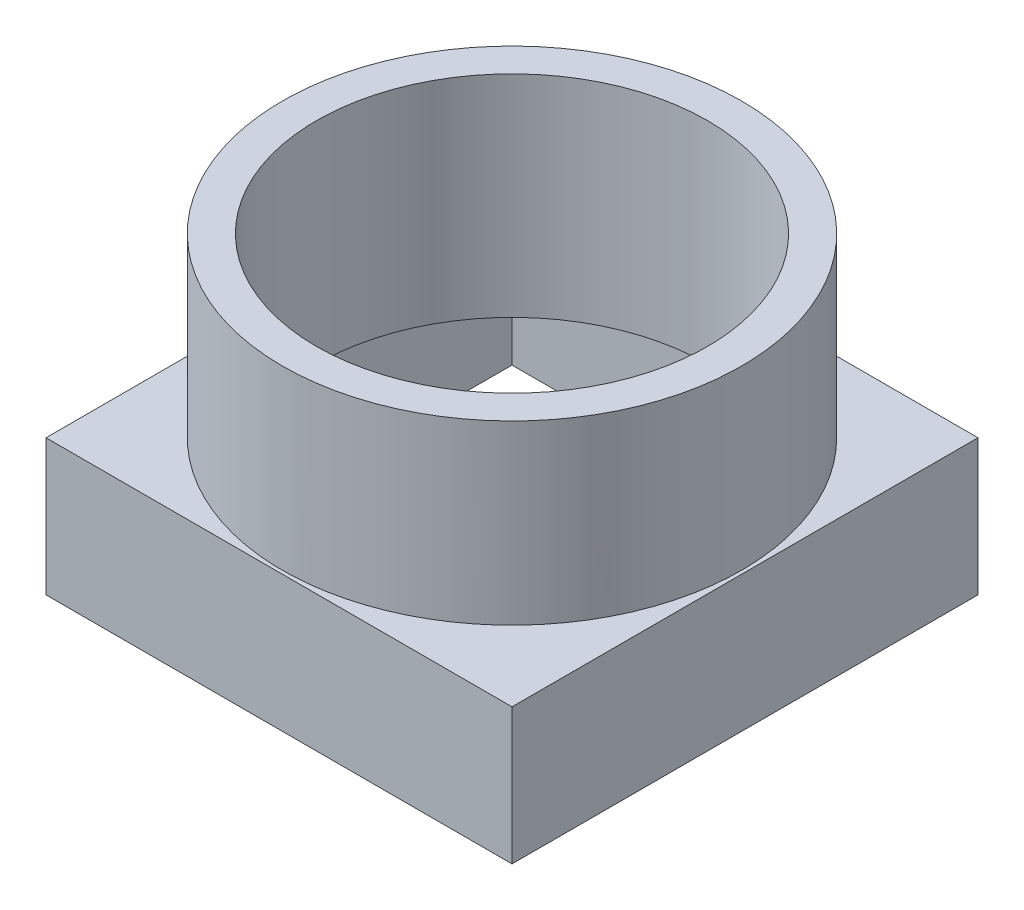
ISO-10303-21;
HEADER;
FILE_DESCRIPTION(('STEP AP214'),'2;1');
FILE_NAME('part.step','',(''),(''),'','','');
FILE_SCHEMA(('AUTOMOTIVE_DESIGN { 1 0 10303 214 1 1 1 1 }'));
ENDSEC;
DATA;
#1=APPLICATION_CONTEXT('core data for automotive mechanical design processes');
#2=APPLICATION_PROTOCOL_DEFINITION('international standard','automotive_design',2000,#1);
#3=PRODUCT_CONTEXT('',#1,'mechanical');
#4=PRODUCT('Part','Part','',(#3));
#5=PRODUCT_RELATED_PRODUCT_CATEGORY('part','',(#4));
#6=PRODUCT_DEFINITION_FORMATION('','',#4);
#7=PRODUCT_DEFINITION_CONTEXT('part definition',#1,'design');
#8=PRODUCT_DEFINITION('design','',#6,#7);
#9=PRODUCT_DEFINITION_SHAPE('','',#8);
#10=(LENGTH_UNIT() NAMED_UNIT(*) SI_UNIT(.MILLI.,.METRE.));
#11=(NAMED_UNIT(*) PLANE_ANGLE_UNIT() SI_UNIT($,.RADIAN.));
#12=(NAMED_UNIT(*) SI_UNIT($,.STERADIAN.) SOLID_ANGLE_UNIT());
#13=UNCERTAINTY_MEASURE_WITH_UNIT(LENGTH_MEASURE(1.E-05),#10,'distance_accuracy_value','');
#14=(GEOMETRIC_REPRESENTATION_CONTEXT(3) GLOBAL_UNCERTAINTY_ASSIGNED_CONTEXT((#13)) GLOBAL_UNIT_ASSIGNED_CONTEXT((#10,
#11,#12)) REPRESENTATION_CONTEXT('',''));
#15=CARTESIAN_POINT('',(0.,0.,0.));
#16=DIRECTION('',(0.,0.,1.));
#17=DIRECTION('',(1.,0.,0.));
#18=AXIS2_PLACEMENT_3D('',#15,#16,#17);
#19=CARTESIAN_POINT('',(-6.85,4.,-6.85));
#20=DIRECTION('',(0.,0.,-1.));
#21=DIRECTION('',(-1.,0.,0.));
#22=AXIS2_PLACEMENT_3D('',#19,#20,#21);
#23=PLANE('',#22);
#24=DIRECTION('',(1.,0.,0.));
#25=VECTOR('',#24,1.);
#26=CARTESIAN_POINT('',(-6.85,0.,-6.85));
#27=LINE('',#26,#25);
#28=CARTESIAN_POINT('',(-6.85,0.,-6.85));
#29=VERTEX_POINT('',#28);
#30=CARTESIAN_POINT('',(6.85,0.,-6.85));
#31=VERTEX_POINT('',#30);
#32=EDGE_CURVE('E155',#29,#31,#27,.T.);
#33=ORIENTED_EDGE('',*,*,#32,.F.);
#34=DIRECTION('',(0.,-1.,0.));
#35=VECTOR('',#34,1.);
#36=CARTESIAN_POINT('',(-6.85,4.,-6.85));
#37=LINE('',#36,#35);
#38=CARTESIAN_POINT('',(-6.85,4.,-6.85));
#39=VERTEX_POINT('',#38);
#40=EDGE_CURVE('E44',#39,#29,#37,.T.);
#41=ORIENTED_EDGE('',*,*,#40,.F.);
#42=DIRECTION('',(1.,0.,0.));
#43=VECTOR('',#42,1.);
#44=CARTESIAN_POINT('',(-6.85,4.,-6.85));
#45=LINE('',#44,#43);
#46=CARTESIAN_POINT('',(6.85,4.,-6.85));
#47=VERTEX_POINT('',#46);
#48=EDGE_CURVE('E157',#39,#47,#45,.T.);
#49=ORIENTED_EDGE('',*,*,#48,.T.);
#50=DIRECTION('',(0.,-1.,0.));
#51=VECTOR('',#50,1.);
#52=CARTESIAN_POINT('',(6.85,4.,-6.85));
#53=LINE('',#52,#51);
#54=EDGE_CURVE('E39',#47,#31,#53,.T.);
#55=ORIENTED_EDGE('',*,*,#54,.T.);
#56=EDGE_LOOP('',(#33,#41,#49,#55));
#57=FACE_BOUND('',#56,.T.);
#58=ADVANCED_FACE('F36',(#57),#23,.T.);
#59=CARTESIAN_POINT('',(-6.85,4.,-6.85));
#60=DIRECTION('',(1.,0.,0.));
#61=DIRECTION('',(0.,0.,-1.));
#62=AXIS2_PLACEMENT_3D('',#59,#60,#61);
#63=PLANE('',#62);
#64=DIRECTION('',(0.,0.,1.));
#65=VECTOR('',#64,1.);
#66=CARTESIAN_POINT('',(-6.85,0.,-6.85));
#67=LINE('',#66,#65);
#68=CARTESIAN_POINT('',(-6.85,0.,6.85));
#69=VERTEX_POINT('',#68);
#70=EDGE_CURVE('E160',#29,#69,#67,.T.);
#71=ORIENTED_EDGE('',*,*,#70,.T.);
#72=DIRECTION('',(0.,-1.,0.));
#73=VECTOR('',#72,1.);
#74=CARTESIAN_POINT('',(-6.85,4.,6.85));
#75=LINE('',#74,#73);
#76=CARTESIAN_POINT('',(-6.85,4.,6.85));
#77=VERTEX_POINT('',#76);
#78=EDGE_CURVE('E176',#77,#69,#75,.T.);
#79=ORIENTED_EDGE('',*,*,#78,.F.);
#80=DIRECTION('',(0.,0.,1.));
#81=VECTOR('',#80,1.);
#82=CARTESIAN_POINT('',(-6.85,4.,-6.85));
#83=LINE('',#82,#81);
#84=EDGE_CURVE('E164',#39,#77,#83,.T.);
#85=ORIENTED_EDGE('',*,*,#84,.F.);
#86=ORIENTED_EDGE('',*,*,#40,.T.);
#87=EDGE_LOOP('',(#71,#79,#85,#86));
#88=FACE_BOUND('',#87,.T.);
#89=ADVANCED_FACE('F186',(#88),#63,.F.);
#90=CARTESIAN_POINT('',(-6.85,4.,6.85));
#91=DIRECTION('',(0.,0.,-1.));
#92=DIRECTION('',(-1.,0.,0.));
#93=AXIS2_PLACEMENT_3D('',#90,#91,#92);
#94=PLANE('',#93);
#95=DIRECTION('',(1.,0.,0.));
#96=VECTOR('',#95,1.);
#97=CARTESIAN_POINT('',(-6.85,0.,6.85));
#98=LINE('',#97,#96);
#99=CARTESIAN_POINT('',(6.85,0.,6.85));
#100=VERTEX_POINT('',#99);
#101=EDGE_CURVE('E171',#69,#100,#98,.T.);
#102=ORIENTED_EDGE('',*,*,#101,.T.);
#103=DIRECTION('',(0.,-1.,0.));
#104=VECTOR('',#103,1.);
#105=CARTESIAN_POINT('',(6.85,4.,6.85));
#106=LINE('',#105,#104);
#107=CARTESIAN_POINT('',(6.85,4.,6.85));
#108=VERTEX_POINT('',#107);
#109=EDGE_CURVE('E178',#108,#100,#106,.T.);
#110=ORIENTED_EDGE('',*,*,#109,.F.);
#111=DIRECTION('',(1.,0.,0.));
#112=VECTOR('',#111,1.);
#113=CARTESIAN_POINT('',(-6.85,4.,6.85));
#114=LINE('',#113,#112);
#115=EDGE_CURVE('E162',#77,#108,#114,.T.);
#116=ORIENTED_EDGE('',*,*,#115,.F.);
#117=ORIENTED_EDGE('',*,*,#78,.T.);
#118=EDGE_LOOP('',(#102,#110,#116,#117));
#119=FACE_BOUND('',#118,.T.);
#120=ADVANCED_FACE('F189',(#119),#94,.F.);
#121=CARTESIAN_POINT('',(6.85,4.,-6.85));
#122=DIRECTION('',(1.,0.,0.));
#123=DIRECTION('',(0.,0.,-1.));
#124=AXIS2_PLACEMENT_3D('',#121,#122,#123);
#125=PLANE('',#124);
#126=DIRECTION('',(0.,0.,1.));
#127=VECTOR('',#126,1.);
#128=CARTESIAN_POINT('',(6.85,0.,-6.85));
#129=LINE('',#128,#127);
#130=EDGE_CURVE('E168',#31,#100,#129,.T.);
#131=ORIENTED_EDGE('',*,*,#130,.F.);
#132=ORIENTED_EDGE('',*,*,#54,.F.);
#133=DIRECTION('',(0.,0.,1.));
#134=VECTOR('',#133,1.);
#135=CARTESIAN_POINT('',(6.85,4.,-6.85));
#136=LINE('',#135,#134);
#137=EDGE_CURVE('E159',#47,#108,#136,.T.);
#138=ORIENTED_EDGE('',*,*,#137,.T.);
#139=ORIENTED_EDGE('',*,*,#109,.T.);
#140=EDGE_LOOP('',(#131,#132,#138,#139));
#141=FACE_BOUND('',#140,.T.);
#142=ADVANCED_FACE('F181',(#141),#125,.T.);
#143=CARTESIAN_POINT('',(0.,4.,0.));
#144=DIRECTION('',(0.,-1.,0.));
#145=DIRECTION('',(0.,0.,-1.));
#146=AXIS2_PLACEMENT_3D('',#143,#144,#145);
#147=PLANE('',#146);
#148=CARTESIAN_POINT('',(0.,4.,0.));
#149=DIRECTION('',(0.,-1.,0.));
#150=DIRECTION('',(0.,0.,-1.));
#151=AXIS2_PLACEMENT_3D('',#148,#149,#150);
#152=CIRCLE('',#151,6.75);
#153=CARTESIAN_POINT('',(0.,4.,-6.75));
#154=VERTEX_POINT('',#153);
#155=EDGE_CURVE('E11',#154,#154,#152,.F.);
#156=ORIENTED_EDGE('',*,*,#155,.F.);
#157=EDGE_LOOP('',(#156));
#158=FACE_BOUND('',#157,.T.);
#159=ORIENTED_EDGE('',*,*,#48,.F.);
#160=ORIENTED_EDGE('',*,*,#84,.T.);
#161=ORIENTED_EDGE('',*,*,#115,.T.);
#162=ORIENTED_EDGE('',*,*,#137,.F.);
#163=EDGE_LOOP('',(#159,#160,#161,#162));
#164=FACE_BOUND('',#163,.T.);
#165=ADVANCED_FACE('F191',(#158,#164),#147,.F.);
#166=CARTESIAN_POINT('',(0.,0.,0.));
#167=DIRECTION('',(0.,-1.,0.));
#168=DIRECTION('',(0.,0.,-1.));
#169=AXIS2_PLACEMENT_3D('',#166,#167,#168);
#170=PLANE('',#169);
#171=DIRECTION('',(1.,0.,0.));
#172=VECTOR('',#171,1.);
#173=CARTESIAN_POINT('',(0.,0.,-5.85));
#174=LINE('',#173,#172);
#175=CARTESIAN_POINT('',(-5.85,0.,-5.85));
#176=VERTEX_POINT('',#175);
#177=CARTESIAN_POINT('',(5.85,0.,-5.85));
#178=VERTEX_POINT('',#177);
#179=EDGE_CURVE('E145',#176,#178,#174,.T.);
#180=ORIENTED_EDGE('',*,*,#179,.F.);
#181=DIRECTION('',(0.,0.,1.));
#182=VECTOR('',#181,1.);
#183=CARTESIAN_POINT('',(-5.85,0.,0.));
#184=LINE('',#183,#182);
#185=CARTESIAN_POINT('',(-5.85,0.,5.85));
#186=VERTEX_POINT('',#185);
#187=EDGE_CURVE('E113',#176,#186,#184,.T.);
#188=ORIENTED_EDGE('',*,*,#187,.T.);
#189=DIRECTION('',(1.,0.,0.));
#190=VECTOR('',#189,1.);
#191=CARTESIAN_POINT('',(0.,0.,5.85));
#192=LINE('',#191,#190);
#193=CARTESIAN_POINT('',(5.85,0.,5.85));
#194=VERTEX_POINT('',#193);
#195=EDGE_CURVE('E52',#186,#194,#192,.T.);
#196=ORIENTED_EDGE('',*,*,#195,.T.);
#197=DIRECTION('',(0.,0.,1.));
#198=VECTOR('',#197,1.);
#199=CARTESIAN_POINT('',(5.85,0.,0.));
#200=LINE('',#199,#198);
#201=EDGE_CURVE('E147',#178,#194,#200,.T.);
#202=ORIENTED_EDGE('',*,*,#201,.F.);
#203=EDGE_LOOP('',(#180,#188,#196,#202));
#204=FACE_BOUND('',#203,.T.);
#205=ORIENTED_EDGE('',*,*,#32,.T.);
#206=ORIENTED_EDGE('',*,*,#130,.T.);
#207=ORIENTED_EDGE('',*,*,#101,.F.);
#208=ORIENTED_EDGE('',*,*,#70,.F.);
#209=EDGE_LOOP('',(#205,#206,#207,#208));
#210=FACE_BOUND('',#209,.T.);
#211=ADVANCED_FACE('F184',(#204,#210),#170,.T.);
#212=CARTESIAN_POINT('',(0.,9.2,0.));
#213=DIRECTION('',(0.,-1.,0.));
#214=DIRECTION('',(0.,0.,-1.));
#215=AXIS2_PLACEMENT_3D('',#212,#213,#214);
#216=CYLINDRICAL_SURFACE('',#215,6.75);
#217=CARTESIAN_POINT('',(0.,9.2,0.));
#218=DIRECTION('',(0.,1.,0.));
#219=DIRECTION('',(0.,0.,1.));
#220=AXIS2_PLACEMENT_3D('',#217,#218,#219);
#221=CIRCLE('',#220,6.75);
#222=CARTESIAN_POINT('',(0.,9.2,6.75));
#223=VERTEX_POINT('',#222);
#224=EDGE_CURVE('E144',#223,#223,#221,.T.);
#225=ORIENTED_EDGE('',*,*,#224,.F.);
#226=EDGE_LOOP('',(#225));
#227=FACE_BOUND('',#226,.T.);
#228=ORIENTED_EDGE('',*,*,#155,.T.);
#229=EDGE_LOOP('',(#228));
#230=FACE_BOUND('',#229,.T.);
#231=ADVANCED_FACE('F199',(#227,#230),#216,.T.);
#232=CARTESIAN_POINT('',(0.,9.2,0.));
#233=DIRECTION('',(0.,1.,0.));
#234=DIRECTION('',(0.,0.,1.));
#235=AXIS2_PLACEMENT_3D('',#232,#233,#234);
#236=PLANE('',#235);
#237=CARTESIAN_POINT('',(0.,9.2,0.));
#238=DIRECTION('',(0.,1.,0.));
#239=DIRECTION('',(0.,0.,1.));
#240=AXIS2_PLACEMENT_3D('',#237,#238,#239);
#241=CIRCLE('',#240,5.75);
#242=CARTESIAN_POINT('',(0.,9.2,5.75));
#243=VERTEX_POINT('',#242);
#244=EDGE_CURVE('E148',#243,#243,#241,.T.);
#245=ORIENTED_EDGE('',*,*,#244,.F.);
#246=EDGE_LOOP('',(#245));
#247=FACE_BOUND('',#246,.T.);
#248=ORIENTED_EDGE('',*,*,#224,.T.);
#249=EDGE_LOOP('',(#248));
#250=FACE_BOUND('',#249,.T.);
#251=ADVANCED_FACE('F233',(#247,#250),#236,.T.);
#252=CARTESIAN_POINT('',(-6.85,4.,-5.85));
#253=DIRECTION('',(0.,0.,-1.));
#254=DIRECTION('',(-1.,0.,0.));
#255=AXIS2_PLACEMENT_3D('',#252,#253,#254);
#256=PLANE('',#255);
#257=ORIENTED_EDGE('',*,*,#179,.T.);
#258=DIRECTION('',(0.,-1.,0.));
#259=VECTOR('',#258,1.);
#260=CARTESIAN_POINT('',(5.85,4.,-5.85));
#261=LINE('',#260,#259);
#262=CARTESIAN_POINT('',(5.85,3.,-5.85));
#263=VERTEX_POINT('',#262);
#264=EDGE_CURVE('E128',#263,#178,#261,.T.);
#265=ORIENTED_EDGE('',*,*,#264,.F.);
#266=DIRECTION('',(1.,0.,0.));
#267=VECTOR('',#266,1.);
#268=CARTESIAN_POINT('',(0.,3.,-5.85));
#269=LINE('',#268,#267);
#270=CARTESIAN_POINT('',(-5.85,3.,-5.85));
#271=VERTEX_POINT('',#270);
#272=EDGE_CURVE('E126',#271,#263,#269,.T.);
#273=ORIENTED_EDGE('',*,*,#272,.F.);
#274=DIRECTION('',(0.,-1.,0.));
#275=VECTOR('',#274,1.);
#276=CARTESIAN_POINT('',(-5.85,4.,-5.85));
#277=LINE('',#276,#275);
#278=EDGE_CURVE('E108',#271,#176,#277,.T.);
#279=ORIENTED_EDGE('',*,*,#278,.T.);
#280=EDGE_LOOP('',(#257,#265,#273,#279));
#281=FACE_BOUND('',#280,.T.);
#282=ADVANCED_FACE('F130',(#281),#256,.F.);
#283=CARTESIAN_POINT('',(-5.85,4.,-6.85));
#284=DIRECTION('',(1.,0.,0.));
#285=DIRECTION('',(0.,0.,-1.));
#286=AXIS2_PLACEMENT_3D('',#283,#284,#285);
#287=PLANE('',#286);
#288=ORIENTED_EDGE('',*,*,#187,.F.);
#289=ORIENTED_EDGE('',*,*,#278,.F.);
#290=DIRECTION('',(0.,0.,1.));
#291=VECTOR('',#290,1.);
#292=CARTESIAN_POINT('',(-5.85,3.,0.));
#293=LINE('',#292,#291);
#294=CARTESIAN_POINT('',(-5.85,3.,5.85));
#295=VERTEX_POINT('',#294);
#296=EDGE_CURVE('E111',#271,#295,#293,.T.);
#297=ORIENTED_EDGE('',*,*,#296,.T.);
#298=DIRECTION('',(0.,-1.,0.));
#299=VECTOR('',#298,1.);
#300=CARTESIAN_POINT('',(-5.85,4.,5.85));
#301=LINE('',#300,#299);
#302=EDGE_CURVE('E119',#295,#186,#301,.T.);
#303=ORIENTED_EDGE('',*,*,#302,.T.);
#304=EDGE_LOOP('',(#288,#289,#297,#303));
#305=FACE_BOUND('',#304,.T.);
#306=ADVANCED_FACE('F110',(#305),#287,.T.);
#307=CARTESIAN_POINT('',(-6.85,4.,5.85));
#308=DIRECTION('',(0.,0.,-1.));
#309=DIRECTION('',(-1.,0.,0.));
#310=AXIS2_PLACEMENT_3D('',#307,#308,#309);
#311=PLANE('',#310);
#312=ORIENTED_EDGE('',*,*,#195,.F.);
#313=ORIENTED_EDGE('',*,*,#302,.F.);
#314=DIRECTION('',(1.,0.,0.));
#315=VECTOR('',#314,1.);
#316=CARTESIAN_POINT('',(0.,3.,5.85));
#317=LINE('',#316,#315);
#318=CARTESIAN_POINT('',(5.85,3.,5.85));
#319=VERTEX_POINT('',#318);
#320=EDGE_CURVE('E127',#295,#319,#317,.T.);
#321=ORIENTED_EDGE('',*,*,#320,.T.);
#322=DIRECTION('',(0.,-1.,0.));
#323=VECTOR('',#322,1.);
#324=CARTESIAN_POINT('',(5.85,4.,5.85));
#325=LINE('',#324,#323);
#326=EDGE_CURVE('E138',#319,#194,#325,.T.);
#327=ORIENTED_EDGE('',*,*,#326,.T.);
#328=EDGE_LOOP('',(#312,#313,#321,#327));
#329=FACE_BOUND('',#328,.T.);
#330=ADVANCED_FACE('F264',(#329),#311,.T.);
#331=CARTESIAN_POINT('',(5.85,4.,-6.85));
#332=DIRECTION('',(1.,0.,0.));
#333=DIRECTION('',(0.,0.,-1.));
#334=AXIS2_PLACEMENT_3D('',#331,#332,#333);
#335=PLANE('',#334);
#336=ORIENTED_EDGE('',*,*,#201,.T.);
#337=ORIENTED_EDGE('',*,*,#326,.F.);
#338=DIRECTION('',(0.,0.,1.));
#339=VECTOR('',#338,1.);
#340=CARTESIAN_POINT('',(5.85,3.,0.));
#341=LINE('',#340,#339);
#342=EDGE_CURVE('E132',#263,#319,#341,.T.);
#343=ORIENTED_EDGE('',*,*,#342,.F.);
#344=ORIENTED_EDGE('',*,*,#264,.T.);
#345=EDGE_LOOP('',(#336,#337,#343,#344));
#346=FACE_BOUND('',#345,.T.);
#347=ADVANCED_FACE('F273',(#346),#335,.F.);
#348=CARTESIAN_POINT('',(0.,3.,0.));
#349=DIRECTION('',(0.,-1.,0.));
#350=DIRECTION('',(0.,0.,-1.));
#351=AXIS2_PLACEMENT_3D('',#348,#349,#350);
#352=PLANE('',#351);
#353=CARTESIAN_POINT('',(0.,3.,0.));
#354=DIRECTION('',(0.,-1.,0.));
#355=DIRECTION('',(0.,0.,-1.));
#356=AXIS2_PLACEMENT_3D('',#353,#354,#355);
#357=CIRCLE('',#356,5.75);
#358=CARTESIAN_POINT('',(0.,3.,-5.75));
#359=VERTEX_POINT('',#358);
#360=EDGE_CURVE('E118',#359,#359,#357,.F.);
#361=ORIENTED_EDGE('',*,*,#360,.T.);
#362=EDGE_LOOP('',(#361));
#363=FACE_BOUND('',#362,.T.);
#364=ORIENTED_EDGE('',*,*,#272,.T.);
#365=ORIENTED_EDGE('',*,*,#342,.T.);
#366=ORIENTED_EDGE('',*,*,#320,.F.);
#367=ORIENTED_EDGE('',*,*,#296,.F.);
#368=EDGE_LOOP('',(#364,#365,#366,#367));
#369=FACE_BOUND('',#368,.T.);
#370=ADVANCED_FACE('F124',(#363,#369),#352,.T.);
#371=CARTESIAN_POINT('',(0.,9.2,0.));
#372=DIRECTION('',(0.,-1.,0.));
#373=DIRECTION('',(0.,0.,-1.));
#374=AXIS2_PLACEMENT_3D('',#371,#372,#373);
#375=CYLINDRICAL_SURFACE('',#374,5.75);
#376=ORIENTED_EDGE('',*,*,#244,.T.);
#377=EDGE_LOOP('',(#376));
#378=FACE_BOUND('',#377,.T.);
#379=ORIENTED_EDGE('',*,*,#360,.F.);
#380=EDGE_LOOP('',(#379));
#381=FACE_BOUND('',#380,.T.);
#382=ADVANCED_FACE('F291',(#378,#381),#375,.F.);
#383=CLOSED_SHELL('',(#58,#89,#120,#142,#165,#211,#231,#251,#282,#306,#330,#347,#370,#382));
#384=MANIFOLD_SOLID_BREP('B2',#383);
#385=ADVANCED_BREP_SHAPE_REPRESENTATION('',(#18,#384),#14);
#386=SHAPE_DEFINITION_REPRESENTATION(#9,#385);
ENDSEC;
END-ISO-10303-21;
